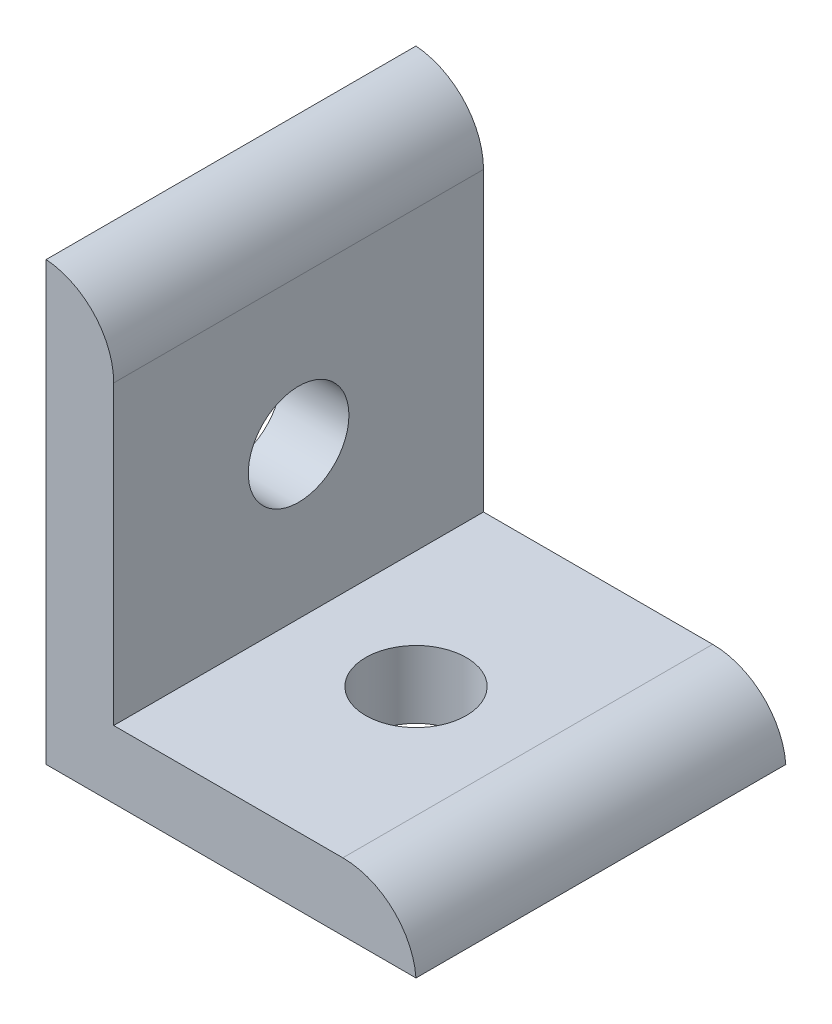
ISO-10303-21;
HEADER;
FILE_DESCRIPTION(('STEP AP214'),'2;1');
FILE_NAME('part.step','',(''),(''),'','','');
FILE_SCHEMA(('AUTOMOTIVE_DESIGN { 1 0 10303 214 1 1 1 1 }'));
ENDSEC;
DATA;
#1=APPLICATION_CONTEXT('core data for automotive mechanical design processes');
#2=APPLICATION_PROTOCOL_DEFINITION('international standard','automotive_design',2000,#1);
#3=PRODUCT_CONTEXT('',#1,'mechanical');
#4=PRODUCT('Part','Part','',(#3));
#5=PRODUCT_RELATED_PRODUCT_CATEGORY('part','',(#4));
#6=PRODUCT_DEFINITION_FORMATION('','',#4);
#7=PRODUCT_DEFINITION_CONTEXT('part definition',#1,'design');
#8=PRODUCT_DEFINITION('design','',#6,#7);
#9=PRODUCT_DEFINITION_SHAPE('','',#8);
#10=(LENGTH_UNIT() NAMED_UNIT(*) SI_UNIT(.MILLI.,.METRE.));
#11=(NAMED_UNIT(*) PLANE_ANGLE_UNIT() SI_UNIT($,.RADIAN.));
#12=(NAMED_UNIT(*) SI_UNIT($,.STERADIAN.) SOLID_ANGLE_UNIT());
#13=UNCERTAINTY_MEASURE_WITH_UNIT(LENGTH_MEASURE(1.E-05),#10,'distance_accuracy_value','');
#14=(GEOMETRIC_REPRESENTATION_CONTEXT(3) GLOBAL_UNCERTAINTY_ASSIGNED_CONTEXT((#13)) GLOBAL_UNIT_ASSIGNED_CONTEXT((#10,
#11,#12)) REPRESENTATION_CONTEXT('',''));
#15=CARTESIAN_POINT('',(0.,0.,0.));
#16=DIRECTION('',(0.,0.,1.));
#17=DIRECTION('',(1.,0.,0.));
#18=AXIS2_PLACEMENT_3D('',#15,#16,#17);
#19=CARTESIAN_POINT('',(0.,4.6,0.));
#20=DIRECTION('',(0.,-1.,0.));
#21=DIRECTION('',(0.,0.,-1.));
#22=AXIS2_PLACEMENT_3D('',#19,#20,#21);
#23=PLANE('',#22);
#24=CARTESIAN_POINT('',(12.6,4.6,-12.6));
#25=DIRECTION('',(0.,1.,0.));
#26=DIRECTION('',(0.,0.,1.));
#27=AXIS2_PLACEMENT_3D('',#24,#25,#26);
#28=CIRCLE('',#27,3.429);
#29=CARTESIAN_POINT('',(12.6,4.6,-9.171));
#30=VERTEX_POINT('',#29);
#31=EDGE_CURVE('E128',#30,#30,#28,.T.);
#32=ORIENTED_EDGE('',*,*,#31,.F.);
#33=EDGE_LOOP('',(#32));
#34=FACE_BOUND('',#33,.T.);
#35=DIRECTION('',(1.,0.,0.));
#36=VECTOR('',#35,1.);
#37=CARTESIAN_POINT('',(0.,4.6,0.));
#38=LINE('',#37,#36);
#39=CARTESIAN_POINT('',(4.6,4.6,0.));
#40=VERTEX_POINT('',#39);
#41=CARTESIAN_POINT('',(20.2160256822492,4.6,0.));
#42=VERTEX_POINT('',#41);
#43=EDGE_CURVE('E133',#40,#42,#38,.T.);
#44=ORIENTED_EDGE('',*,*,#43,.T.);
#45=DIRECTION('',(0.,0.,1.));
#46=VECTOR('',#45,1.);
#47=CARTESIAN_POINT('',(20.2160256822492,4.6,0.));
#48=LINE('',#47,#46);
#49=CARTESIAN_POINT('',(20.2160256822492,4.6,-25.2));
#50=VERTEX_POINT('',#49);
#51=EDGE_CURVE('E11',#42,#50,#48,.F.);
#52=ORIENTED_EDGE('',*,*,#51,.T.);
#53=DIRECTION('',(-1.,0.,0.));
#54=VECTOR('',#53,1.);
#55=CARTESIAN_POINT('',(0.,4.6,-25.2));
#56=LINE('',#55,#54);
#57=CARTESIAN_POINT('',(4.6,4.6,-25.2));
#58=VERTEX_POINT('',#57);
#59=EDGE_CURVE('E135',#50,#58,#56,.T.);
#60=ORIENTED_EDGE('',*,*,#59,.T.);
#61=DIRECTION('',(0.,0.,-1.));
#62=VECTOR('',#61,1.);
#63=CARTESIAN_POINT('',(4.6,4.6,-25.2));
#64=LINE('',#63,#62);
#65=EDGE_CURVE('E116',#40,#58,#64,.T.);
#66=ORIENTED_EDGE('',*,*,#65,.F.);
#67=EDGE_LOOP('',(#44,#52,#60,#66));
#68=FACE_BOUND('',#67,.T.);
#69=ADVANCED_FACE('F41',(#34,#68),#23,.F.);
#70=CARTESIAN_POINT('',(0.,0.,0.));
#71=DIRECTION('',(0.,-1.,0.));
#72=DIRECTION('',(0.,0.,-1.));
#73=AXIS2_PLACEMENT_3D('',#70,#71,#72);
#74=PLANE('',#73);
#75=DIRECTION('',(0.,0.,1.));
#76=VECTOR('',#75,1.);
#77=CARTESIAN_POINT('',(0.,0.,0.));
#78=LINE('',#77,#76);
#79=CARTESIAN_POINT('',(0.,0.,-25.2));
#80=VERTEX_POINT('',#79);
#81=CARTESIAN_POINT('',(0.,0.,0.));
#82=VERTEX_POINT('',#81);
#83=EDGE_CURVE('E108',#80,#82,#78,.T.);
#84=ORIENTED_EDGE('',*,*,#83,.F.);
#85=DIRECTION('',(-1.,0.,0.));
#86=VECTOR('',#85,1.);
#87=CARTESIAN_POINT('',(0.,0.,-25.2));
#88=LINE('',#87,#86);
#89=CARTESIAN_POINT('',(25.2,0.,-25.2));
#90=VERTEX_POINT('',#89);
#91=EDGE_CURVE('E136',#90,#80,#88,.T.);
#92=ORIENTED_EDGE('',*,*,#91,.F.);
#93=DIRECTION('',(0.,0.,-1.));
#94=VECTOR('',#93,1.);
#95=CARTESIAN_POINT('',(25.2,0.,0.));
#96=LINE('',#95,#94);
#97=CARTESIAN_POINT('',(25.2,0.,0.));
#98=VERTEX_POINT('',#97);
#99=EDGE_CURVE('E141',#98,#90,#96,.T.);
#100=ORIENTED_EDGE('',*,*,#99,.F.);
#101=DIRECTION('',(1.,0.,0.));
#102=VECTOR('',#101,1.);
#103=CARTESIAN_POINT('',(0.,0.,0.));
#104=LINE('',#103,#102);
#105=EDGE_CURVE('E139',#82,#98,#104,.T.);
#106=ORIENTED_EDGE('',*,*,#105,.F.);
#107=EDGE_LOOP('',(#84,#92,#100,#106));
#108=FACE_BOUND('',#107,.T.);
#109=CARTESIAN_POINT('',(12.6,0.,-12.6));
#110=DIRECTION('',(0.,1.,0.));
#111=DIRECTION('',(0.,0.,1.));
#112=AXIS2_PLACEMENT_3D('',#109,#110,#111);
#113=CIRCLE('',#112,3.429);
#114=CARTESIAN_POINT('',(12.6,0.,-9.171));
#115=VERTEX_POINT('',#114);
#116=EDGE_CURVE('E127',#115,#115,#113,.T.);
#117=ORIENTED_EDGE('',*,*,#116,.T.);
#118=EDGE_LOOP('',(#117));
#119=FACE_BOUND('',#118,.T.);
#120=ADVANCED_FACE('F160',(#108,#119),#74,.T.);
#121=CARTESIAN_POINT('',(0.,4.6,0.));
#122=DIRECTION('',(1.,0.,0.));
#123=DIRECTION('',(0.,0.,-1.));
#124=AXIS2_PLACEMENT_3D('',#121,#122,#123);
#125=PLANE('',#124);
#126=CARTESIAN_POINT('',(0.,14.9,-12.6));
#127=DIRECTION('',(1.,0.,0.));
#128=DIRECTION('',(0.,0.,-1.));
#129=AXIS2_PLACEMENT_3D('',#126,#127,#128);
#130=CIRCLE('',#129,3.429);
#131=CARTESIAN_POINT('',(0.,14.9,-16.029));
#132=VERTEX_POINT('',#131);
#133=EDGE_CURVE('E121',#132,#132,#130,.F.);
#134=ORIENTED_EDGE('',*,*,#133,.F.);
#135=EDGE_LOOP('',(#134));
#136=FACE_BOUND('',#135,.T.);
#137=ORIENTED_EDGE('',*,*,#83,.T.);
#138=DIRECTION('',(0.,-1.,0.));
#139=VECTOR('',#138,1.);
#140=CARTESIAN_POINT('',(0.,4.6,0.));
#141=LINE('',#140,#139);
#142=CARTESIAN_POINT('',(0.,29.8,0.));
#143=VERTEX_POINT('',#142);
#144=EDGE_CURVE('E97',#143,#82,#141,.T.);
#145=ORIENTED_EDGE('',*,*,#144,.F.);
#146=DIRECTION('',(0.,0.,1.));
#147=VECTOR('',#146,1.);
#148=CARTESIAN_POINT('',(0.,29.8,-25.2));
#149=LINE('',#148,#147);
#150=CARTESIAN_POINT('',(0.,29.8,-25.2));
#151=VERTEX_POINT('',#150);
#152=EDGE_CURVE('E106',#151,#143,#149,.T.);
#153=ORIENTED_EDGE('',*,*,#152,.F.);
#154=DIRECTION('',(0.,-1.,0.));
#155=VECTOR('',#154,1.);
#156=CARTESIAN_POINT('',(0.,4.6,-25.2));
#157=LINE('',#156,#155);
#158=EDGE_CURVE('E110',#151,#80,#157,.T.);
#159=ORIENTED_EDGE('',*,*,#158,.T.);
#160=EDGE_LOOP('',(#137,#145,#153,#159));
#161=FACE_BOUND('',#160,.T.);
#162=ADVANCED_FACE('F104',(#136,#161),#125,.F.);
#163=CARTESIAN_POINT('',(0.,4.6,0.));
#164=DIRECTION('',(0.,0.,-1.));
#165=DIRECTION('',(-1.,0.,0.));
#166=AXIS2_PLACEMENT_3D('',#163,#164,#165);
#167=PLANE('',#166);
#168=DIRECTION('',(0.,-1.,0.));
#169=VECTOR('',#168,1.);
#170=CARTESIAN_POINT('',(4.6,29.8,0.));
#171=LINE('',#170,#169);
#172=CARTESIAN_POINT('',(4.6,24.8160256822492,0.));
#173=VERTEX_POINT('',#172);
#174=EDGE_CURVE('E99',#173,#40,#171,.T.);
#175=ORIENTED_EDGE('',*,*,#174,.F.);
#176=CARTESIAN_POINT('',(-0.399999999999997,24.8160256822492,0.));
#177=DIRECTION('',(0.,0.,-1.));
#178=DIRECTION('',(-1.,0.,0.));
#179=AXIS2_PLACEMENT_3D('',#176,#177,#178);
#180=CIRCLE('',#179,5.);
#181=EDGE_CURVE('E49',#173,#143,#180,.F.);
#182=ORIENTED_EDGE('',*,*,#181,.T.);
#183=ORIENTED_EDGE('',*,*,#144,.T.);
#184=ORIENTED_EDGE('',*,*,#105,.T.);
#185=CARTESIAN_POINT('',(20.2160256822492,-0.4,0.));
#186=DIRECTION('',(0.,0.,-1.));
#187=DIRECTION('',(-1.,0.,0.));
#188=AXIS2_PLACEMENT_3D('',#185,#186,#187);
#189=CIRCLE('',#188,5.);
#190=EDGE_CURVE('E56',#98,#42,#189,.F.);
#191=ORIENTED_EDGE('',*,*,#190,.T.);
#192=ORIENTED_EDGE('',*,*,#43,.F.);
#193=EDGE_LOOP('',(#175,#182,#183,#184,#191,#192));
#194=FACE_BOUND('',#193,.T.);
#195=ADVANCED_FACE('F96',(#194),#167,.F.);
#196=CARTESIAN_POINT('',(0.,4.6,-25.2));
#197=DIRECTION('',(0.,0.,1.));
#198=DIRECTION('',(1.,0.,0.));
#199=AXIS2_PLACEMENT_3D('',#196,#197,#198);
#200=PLANE('',#199);
#201=ORIENTED_EDGE('',*,*,#158,.F.);
#202=CARTESIAN_POINT('',(-0.399999999999997,24.8160256822492,-25.2));
#203=DIRECTION('',(0.,0.,1.));
#204=DIRECTION('',(1.,0.,0.));
#205=AXIS2_PLACEMENT_3D('',#202,#203,#204);
#206=CIRCLE('',#205,5.);
#207=CARTESIAN_POINT('',(4.6,24.8160256822492,-25.2));
#208=VERTEX_POINT('',#207);
#209=EDGE_CURVE('E113',#151,#208,#206,.F.);
#210=ORIENTED_EDGE('',*,*,#209,.T.);
#211=DIRECTION('',(0.,-1.,0.));
#212=VECTOR('',#211,1.);
#213=CARTESIAN_POINT('',(4.6,29.8,-25.2));
#214=LINE('',#213,#212);
#215=EDGE_CURVE('E115',#208,#58,#214,.T.);
#216=ORIENTED_EDGE('',*,*,#215,.T.);
#217=ORIENTED_EDGE('',*,*,#59,.F.);
#218=CARTESIAN_POINT('',(20.2160256822492,-0.4,-25.2));
#219=DIRECTION('',(0.,0.,1.));
#220=DIRECTION('',(1.,0.,0.));
#221=AXIS2_PLACEMENT_3D('',#218,#219,#220);
#222=CIRCLE('',#221,5.);
#223=EDGE_CURVE('E109',#50,#90,#222,.F.);
#224=ORIENTED_EDGE('',*,*,#223,.T.);
#225=ORIENTED_EDGE('',*,*,#91,.T.);
#226=EDGE_LOOP('',(#201,#210,#216,#217,#224,#225));
#227=FACE_BOUND('',#226,.T.);
#228=ADVANCED_FACE('F150',(#227),#200,.F.);
#229=CARTESIAN_POINT('',(12.6,4.6,-12.6));
#230=DIRECTION('',(0.,-1.,0.));
#231=DIRECTION('',(0.,0.,-1.));
#232=AXIS2_PLACEMENT_3D('',#229,#230,#231);
#233=CYLINDRICAL_SURFACE('',#232,3.429);
#234=ORIENTED_EDGE('',*,*,#31,.T.);
#235=EDGE_LOOP('',(#234));
#236=FACE_BOUND('',#235,.T.);
#237=ORIENTED_EDGE('',*,*,#116,.F.);
#238=EDGE_LOOP('',(#237));
#239=FACE_BOUND('',#238,.T.);
#240=ADVANCED_FACE('F177',(#236,#239),#233,.F.);
#241=CARTESIAN_POINT('',(4.6,29.8,-25.2));
#242=DIRECTION('',(-1.,0.,0.));
#243=DIRECTION('',(0.,0.,1.));
#244=AXIS2_PLACEMENT_3D('',#241,#242,#243);
#245=PLANE('',#244);
#246=CARTESIAN_POINT('',(4.6,14.9,-12.6));
#247=DIRECTION('',(1.,0.,0.));
#248=DIRECTION('',(0.,0.,-1.));
#249=AXIS2_PLACEMENT_3D('',#246,#247,#248);
#250=CIRCLE('',#249,3.429);
#251=CARTESIAN_POINT('',(4.6,14.9,-16.029));
#252=VERTEX_POINT('',#251);
#253=EDGE_CURVE('E191',#252,#252,#250,.T.);
#254=ORIENTED_EDGE('',*,*,#253,.F.);
#255=EDGE_LOOP('',(#254));
#256=FACE_BOUND('',#255,.T.);
#257=ORIENTED_EDGE('',*,*,#215,.F.);
#258=DIRECTION('',(0.,0.,-1.));
#259=VECTOR('',#258,1.);
#260=CARTESIAN_POINT('',(4.6,24.8160256822492,-25.2));
#261=LINE('',#260,#259);
#262=EDGE_CURVE('E64',#208,#173,#261,.F.);
#263=ORIENTED_EDGE('',*,*,#262,.T.);
#264=ORIENTED_EDGE('',*,*,#174,.T.);
#265=ORIENTED_EDGE('',*,*,#65,.T.);
#266=EDGE_LOOP('',(#257,#263,#264,#265));
#267=FACE_BOUND('',#266,.T.);
#268=ADVANCED_FACE('F152',(#256,#267),#245,.F.);
#269=CARTESIAN_POINT('',(-0.00100000000000187,14.9,-12.6));
#270=DIRECTION('',(1.,0.,0.));
#271=DIRECTION('',(0.,0.,-1.));
#272=AXIS2_PLACEMENT_3D('',#269,#270,#271);
#273=CYLINDRICAL_SURFACE('',#272,3.429);
#274=ORIENTED_EDGE('',*,*,#253,.T.);
#275=EDGE_LOOP('',(#274));
#276=FACE_BOUND('',#275,.T.);
#277=ORIENTED_EDGE('',*,*,#133,.T.);
#278=EDGE_LOOP('',(#277));
#279=FACE_BOUND('',#278,.T.);
#280=ADVANCED_FACE('F166',(#276,#279),#273,.F.);
#281=CARTESIAN_POINT('',(-0.399999999999997,24.8160256822492,0.));
#282=DIRECTION('',(0.,0.,-1.));
#283=DIRECTION('',(-1.,0.,0.));
#284=AXIS2_PLACEMENT_3D('',#281,#282,#283);
#285=CYLINDRICAL_SURFACE('',#284,5.);
#286=ORIENTED_EDGE('',*,*,#181,.F.);
#287=ORIENTED_EDGE('',*,*,#262,.F.);
#288=ORIENTED_EDGE('',*,*,#209,.F.);
#289=ORIENTED_EDGE('',*,*,#152,.T.);
#290=EDGE_LOOP('',(#286,#287,#288,#289));
#291=FACE_BOUND('',#290,.T.);
#292=ADVANCED_FACE('F112',(#291),#285,.T.);
#293=CARTESIAN_POINT('',(20.2160256822492,-0.4,0.));
#294=DIRECTION('',(0.,0.,1.));
#295=DIRECTION('',(1.,0.,0.));
#296=AXIS2_PLACEMENT_3D('',#293,#294,#295);
#297=CYLINDRICAL_SURFACE('',#296,5.);
#298=ORIENTED_EDGE('',*,*,#190,.F.);
#299=ORIENTED_EDGE('',*,*,#99,.T.);
#300=ORIENTED_EDGE('',*,*,#223,.F.);
#301=ORIENTED_EDGE('',*,*,#51,.F.);
#302=EDGE_LOOP('',(#298,#299,#300,#301));
#303=FACE_BOUND('',#302,.T.);
#304=ADVANCED_FACE('F43',(#303),#297,.T.);
#305=CLOSED_SHELL('',(#69,#120,#162,#195,#228,#240,#268,#280,#292,#304));
#306=MANIFOLD_SOLID_BREP('B2',#305);
#307=ADVANCED_BREP_SHAPE_REPRESENTATION('',(#18,#306),#14);
#308=SHAPE_DEFINITION_REPRESENTATION(#9,#307);
ENDSEC;
END-ISO-10303-21;
